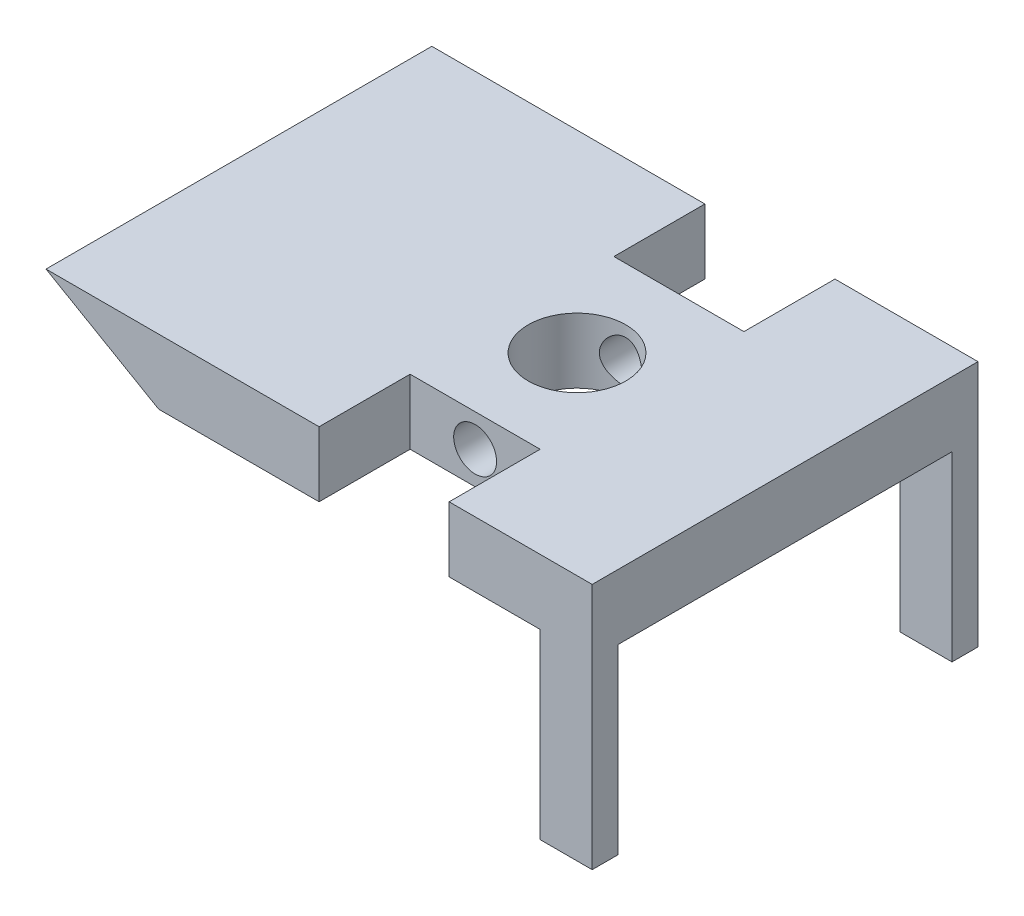
ISO-10303-21;
HEADER;
FILE_DESCRIPTION(('STEP AP214'),'2;1');
FILE_NAME('part.step','',(''),(''),'','','');
FILE_SCHEMA(('AUTOMOTIVE_DESIGN { 1 0 10303 214 1 1 1 1 }'));
ENDSEC;
DATA;
#1=APPLICATION_CONTEXT('core data for automotive mechanical design processes');
#2=APPLICATION_PROTOCOL_DEFINITION('international standard','automotive_design',2000,#1);
#3=PRODUCT_CONTEXT('',#1,'mechanical');
#4=PRODUCT('Part','Part','',(#3));
#5=PRODUCT_RELATED_PRODUCT_CATEGORY('part','',(#4));
#6=PRODUCT_DEFINITION_FORMATION('','',#4);
#7=PRODUCT_DEFINITION_CONTEXT('part definition',#1,'design');
#8=PRODUCT_DEFINITION('design','',#6,#7);
#9=PRODUCT_DEFINITION_SHAPE('','',#8);
#10=(LENGTH_UNIT() NAMED_UNIT(*) SI_UNIT(.MILLI.,.METRE.));
#11=(NAMED_UNIT(*) PLANE_ANGLE_UNIT() SI_UNIT($,.RADIAN.));
#12=(NAMED_UNIT(*) SI_UNIT($,.STERADIAN.) SOLID_ANGLE_UNIT());
#13=UNCERTAINTY_MEASURE_WITH_UNIT(LENGTH_MEASURE(1.E-05),#10,'distance_accuracy_value','');
#14=(GEOMETRIC_REPRESENTATION_CONTEXT(3) GLOBAL_UNCERTAINTY_ASSIGNED_CONTEXT((#13)) GLOBAL_UNIT_ASSIGNED_CONTEXT((#10,
#11,#12)) REPRESENTATION_CONTEXT('',''));
#15=CARTESIAN_POINT('',(0.,0.,0.));
#16=DIRECTION('',(0.,0.,1.));
#17=DIRECTION('',(1.,0.,0.));
#18=AXIS2_PLACEMENT_3D('',#15,#16,#17);
#19=CARTESIAN_POINT('',(17.,-16.5,-29.395219778561));
#20=DIRECTION('',(-1.,0.,0.));
#21=DIRECTION('',(0.,-1.,0.));
#22=AXIS2_PLACEMENT_3D('',#19,#20,#21);
#23=PLANE('',#22);
#24=DIRECTION('',(0.,1.,0.));
#25=VECTOR('',#24,1.);
#26=CARTESIAN_POINT('',(17.,-16.5,12.835));
#27=LINE('',#26,#25);
#28=CARTESIAN_POINT('',(17.,-16.5,12.835));
#29=VERTEX_POINT('',#28);
#30=CARTESIAN_POINT('',(17.,-2.50000000000001,12.835));
#31=VERTEX_POINT('',#30);
#32=EDGE_CURVE('E262',#29,#31,#27,.T.);
#33=ORIENTED_EDGE('',*,*,#32,.F.);
#34=DIRECTION('',(0.,0.,1.));
#35=VECTOR('',#34,1.);
#36=CARTESIAN_POINT('',(17.,-16.5,-29.395219778561));
#37=LINE('',#36,#35);
#38=CARTESIAN_POINT('',(17.,-16.5,14.835));
#39=VERTEX_POINT('',#38);
#40=EDGE_CURVE('E189',#29,#39,#37,.T.);
#41=ORIENTED_EDGE('',*,*,#40,.T.);
#42=DIRECTION('',(0.,-1.,0.));
#43=VECTOR('',#42,1.);
#44=CARTESIAN_POINT('',(17.,-16.5,14.835));
#45=LINE('',#44,#43);
#46=CARTESIAN_POINT('',(17.,-2.50000000000001,14.835));
#47=VERTEX_POINT('',#46);
#48=EDGE_CURVE('E264',#47,#39,#45,.T.);
#49=ORIENTED_EDGE('',*,*,#48,.F.);
#50=DIRECTION('',(0.,0.,1.));
#51=VECTOR('',#50,1.);
#52=CARTESIAN_POINT('',(17.,-2.50000000000001,-29.395219778561));
#53=LINE('',#52,#51);
#54=EDGE_CURVE('E69',#31,#47,#53,.T.);
#55=ORIENTED_EDGE('',*,*,#54,.F.);
#56=EDGE_LOOP('',(#33,#41,#49,#55));
#57=FACE_BOUND('',#56,.T.);
#58=ADVANCED_FACE('F45',(#57),#23,.T.);
#59=CARTESIAN_POINT('',(21.,-16.5,-29.395219778561));
#60=DIRECTION('',(0.,-1.,0.));
#61=DIRECTION('',(1.,0.,0.));
#62=AXIS2_PLACEMENT_3D('',#59,#60,#61);
#63=PLANE('',#62);
#64=DIRECTION('',(-1.,0.,0.));
#65=VECTOR('',#64,1.);
#66=CARTESIAN_POINT('',(21.,-16.5,12.835));
#67=LINE('',#66,#65);
#68=CARTESIAN_POINT('',(21.,-16.5,12.835));
#69=VERTEX_POINT('',#68);
#70=EDGE_CURVE('E11',#69,#29,#67,.T.);
#71=ORIENTED_EDGE('',*,*,#70,.F.);
#72=DIRECTION('',(0.,0.,1.));
#73=VECTOR('',#72,1.);
#74=CARTESIAN_POINT('',(21.,-16.5,-29.395219778561));
#75=LINE('',#74,#73);
#76=CARTESIAN_POINT('',(21.,-16.5,14.835));
#77=VERTEX_POINT('',#76);
#78=EDGE_CURVE('E187',#69,#77,#75,.T.);
#79=ORIENTED_EDGE('',*,*,#78,.T.);
#80=DIRECTION('',(1.,0.,0.));
#81=VECTOR('',#80,1.);
#82=CARTESIAN_POINT('',(21.,-16.5,14.835));
#83=LINE('',#82,#81);
#84=EDGE_CURVE('E269',#39,#77,#83,.T.);
#85=ORIENTED_EDGE('',*,*,#84,.F.);
#86=ORIENTED_EDGE('',*,*,#40,.F.);
#87=EDGE_LOOP('',(#71,#79,#85,#86));
#88=FACE_BOUND('',#87,.T.);
#89=ADVANCED_FACE('F185',(#88),#63,.T.);
#90=CARTESIAN_POINT('',(5.,0.,-14.836));
#91=DIRECTION('',(0.,0.,1.));
#92=DIRECTION('',(1.,0.,0.));
#93=AXIS2_PLACEMENT_3D('',#90,#91,#92);
#94=CYLINDRICAL_SURFACE('',#93,1.65);
#95=CARTESIAN_POINT('',(6.65,0.,-3.36749164809655));
#96=CARTESIAN_POINT('',(6.64999591948725,-0.0874743691332364,-3.36749607292385));
#97=CARTESIAN_POINT('',(6.64299960015496,-0.175092773934502,-3.37094939684784));
#98=CARTESIAN_POINT('',(6.61531716545798,-0.347757116865659,-3.38429832583538));
#99=CARTESIAN_POINT('',(6.59459592274656,-0.43279586708638,-3.39421046041475));
#100=CARTESIAN_POINT('',(6.54044870220548,-0.597493099250666,-3.41912171212209));
#101=CARTESIAN_POINT('',(6.50707857419381,-0.67717344538628,-3.43409843617774));
#102=CARTESIAN_POINT('',(6.42874832845569,-0.829783884986507,-3.46741736925901));
#103=CARTESIAN_POINT('',(6.38379002894348,-0.902715034980056,-3.48575905018413));
#104=CARTESIAN_POINT('',(6.28021734567749,-1.04487154765315,-3.52516638479344));
#105=CARTESIAN_POINT('',(6.22091990046756,-1.11357209474114,-3.54633091062051));
#106=CARTESIAN_POINT('',(6.09178303274802,-1.24044684009399,-3.5881911575404));
#107=CARTESIAN_POINT('',(6.02193928529622,-1.29861669819959,-3.60888668227713));
#108=CARTESIAN_POINT('',(5.86946484491625,-1.40556708343849,-3.64870271327509));
#109=CARTESIAN_POINT('',(5.78637319615618,-1.45374252984986,-3.66769507829858));
#110=CARTESIAN_POINT('',(5.61227632392994,-1.53520034882064,-3.700736202455));
#111=CARTESIAN_POINT('',(5.52127502438019,-1.5684900562803,-3.71478739560396));
#112=CARTESIAN_POINT('',(5.3394662745173,-1.61728382118504,-3.73565913311448));
#113=CARTESIAN_POINT('',(5.24894589824284,-1.63369687425848,-3.74284752867496));
#114=CARTESIAN_POINT('',(5.06617018053506,-1.65122350001048,-3.75052967187645));
#115=CARTESIAN_POINT('',(4.97391564874558,-1.65234404312534,-3.75102646959465));
#116=CARTESIAN_POINT('',(4.79695735459994,-1.63969762210196,-3.74547519866295));
#117=CARTESIAN_POINT('',(4.71216534970809,-1.6269337501266,-3.739868091581));
#118=CARTESIAN_POINT('',(4.5460705321449,-1.58862001141631,-3.72336083389609));
#119=CARTESIAN_POINT('',(4.46476797823857,-1.56306919822083,-3.71246029148675));
#120=CARTESIAN_POINT('',(4.30645273442336,-1.49962622377595,-3.68619520386884));
#121=CARTESIAN_POINT('',(4.22952453920683,-1.46155151512836,-3.67076501619212));
#122=CARTESIAN_POINT('',(4.08294686925941,-1.37433410623966,-3.63691910801703));
#123=CARTESIAN_POINT('',(4.01330005270581,-1.32518738450648,-3.6185023034251));
#124=CARTESIAN_POINT('',(3.87753504589473,-1.21281701199709,-3.57882020061428));
#125=CARTESIAN_POINT('',(3.81210572269681,-1.14879890575554,-3.5574447595915));
#126=CARTESIAN_POINT('',(3.69259260075723,-1.01070787762528,-3.51528240579217));
#127=CARTESIAN_POINT('',(3.63851423294623,-0.936630170451252,-3.49449577883282));
#128=CARTESIAN_POINT('',(3.54117220405855,-0.776800460066391,-3.45502479534648));
#129=CARTESIAN_POINT('',(3.49843008891747,-0.690699088400833,-3.43645839327868));
#130=CARTESIAN_POINT('',(3.42834028609234,-0.511490455495721,-3.40497856582965));
#131=CARTESIAN_POINT('',(3.40098013157646,-0.418388937355618,-3.39206056440346));
#132=CARTESIAN_POINT('',(3.36429227707904,-0.234744535363252,-3.37451456223478));
#133=CARTESIAN_POINT('',(3.35383875555708,-0.144476988157719,-3.36937064835984));
#134=CARTESIAN_POINT('',(3.34792333452705,0.0366498278836484,-3.36647574871939));
#135=CARTESIAN_POINT('',(3.35245516573098,0.127508833402355,-3.36872167133213));
#136=CARTESIAN_POINT('',(3.37535174013094,0.300038323378446,-3.37981562096985));
#137=CARTESIAN_POINT('',(3.39265374352297,0.381886932345077,-3.3881559621082));
#138=CARTESIAN_POINT('',(3.43914744636585,0.541431160999636,-3.40982287754369));
#139=CARTESIAN_POINT('',(3.46834214737761,0.619125726657332,-3.42315071054923));
#140=CARTESIAN_POINT('',(3.53921629690324,0.772027463841052,-3.45400682275722));
#141=CARTESIAN_POINT('',(3.58139272921155,0.846970827739328,-3.47169539316014));
#142=CARTESIAN_POINT('',(3.6765572613445,0.98910154331508,-3.50907546279441));
#143=CARTESIAN_POINT('',(3.72955038819797,1.05628526590527,-3.5287678911715));
#144=CARTESIAN_POINT('',(3.85062358980462,1.18748477509611,-3.57013856276202));
#145=CARTESIAN_POINT('',(3.9196470398001,1.25062896923803,-3.59183160476859));
#146=CARTESIAN_POINT('',(4.06778238636593,1.36462621623268,-3.63309467060809));
#147=CARTESIAN_POINT('',(4.14689558402023,1.41547768147165,-3.65266442003673));
#148=CARTESIAN_POINT('',(4.31400673932617,1.50362813045694,-3.68771558350776));
#149=CARTESIAN_POINT('',(4.40206664806587,1.54082304607772,-3.70316536765515));
#150=CARTESIAN_POINT('',(4.58405684732281,1.59956776607058,-3.72798894821772));
#151=CARTESIAN_POINT('',(4.6779831509097,1.62112807306508,-3.73736682301229));
#152=CARTESIAN_POINT('',(4.8612978165453,1.64656089333974,-3.74847245839303));
#153=CARTESIAN_POINT('',(4.95048512527525,1.65165818539736,-3.75072963755332));
#154=CARTESIAN_POINT('',(5.12843486064658,1.64739798838615,-3.74885512685435));
#155=CARTESIAN_POINT('',(5.21719737386056,1.63804358240265,-3.74472479968784));
#156=CARTESIAN_POINT('',(5.38782932587363,1.60602123171463,-3.7308324127445));
#157=CARTESIAN_POINT('',(5.46983114363675,1.58394115377817,-3.72131934376771));
#158=CARTESIAN_POINT('',(5.62890956243098,1.5277736246503,-3.69776205916142));
#159=CARTESIAN_POINT('',(5.70598528433432,1.493684037231,-3.68371703743449));
#160=CARTESIAN_POINT('',(5.8569304617613,1.41274147649753,-3.65162935021383));
#161=CARTESIAN_POINT('',(5.93049119711801,1.36537526372791,-3.63343300227536));
#162=CARTESIAN_POINT('',(6.06894266820481,1.25993695077241,-3.59513976322225));
#163=CARTESIAN_POINT('',(6.13382977719905,1.20186039623367,-3.57504208305736));
#164=CARTESIAN_POINT('',(6.25831260974055,1.07139703994961,-3.53324031823005));
#165=CARTESIAN_POINT('',(6.31711532685678,0.998252385431581,-3.51153178279635));
#166=CARTESIAN_POINT('',(6.42177534917193,0.842529476107377,-3.47047923678989));
#167=CARTESIAN_POINT('',(6.46762474174623,0.759945498298511,-3.45113667556083));
#168=CARTESIAN_POINT('',(6.5449162136947,0.587124299309076,-3.41723991894323));
#169=CARTESIAN_POINT('',(6.57632700235197,0.496870953906538,-3.40269614232787));
#170=CARTESIAN_POINT('',(6.62309555077018,0.31164351772582,-3.38064338773551));
#171=CARTESIAN_POINT('',(6.6385071714776,0.216686400884638,-3.3731108155642));
#172=CARTESIAN_POINT('',(6.64703108329939,0.100998496777649,-3.36894448238601));
#173=CARTESIAN_POINT('',(6.64814335262455,0.0808209970433322,-3.36840080987488));
#174=CARTESIAN_POINT('',(6.64962829144477,0.0404315640214873,-3.36767387701191));
#175=CARTESIAN_POINT('',(6.65000094320723,0.0202196299200109,-3.36749062530128));
#176=CARTESIAN_POINT('',(6.65,0.,-3.36749164809655));
#177=B_SPLINE_CURVE_WITH_KNOTS('',3,(#95,#96,#97,#98,#99,#100,#101,#102,#103,#104,#105,#106,
#107,#108,#109,#110,#111,#112,#113,#114,#115,#116,#117,#118,#119,#120,#121,#122,#123,#124,#125,
#126,#127,#128,#129,#130,#131,#132,#133,#134,#135,#136,#137,#138,#139,#140,#141,#142,#143,#144,
#145,#146,#147,#148,#149,#150,#151,#152,#153,#154,#155,#156,#157,#158,#159,#160,#161,#162,#163,
#164,#165,#166,#167,#168,#169,#170,#171,#172,#173,#174,#175,#176),.UNSPECIFIED.,.T.,.F.,(4,2,2,
2,2,2,2,2,2,2,2,2,2,2,2,2,2,2,2,2,2,2,2,2,2,2,2,2,2,2,2,2,2,2,2,2,2,2,2,2,4),(0.,
0.262337992001349,0.525350015511181,0.787214015160154,1.04903695265106,1.32739302247777,
1.60586355517072,1.89807751150631,2.19014732125288,2.46549872058573,2.74072460857159,
2.99731128459009,3.25391695538524,3.51444216606865,3.77506215572741,4.05582705551463,
4.336725984226,4.62890596840992,4.92084880275994,5.1924046605751,5.46384692437079,
5.71493513596501,5.96608675823259,6.22839495294345,6.49082533337074,6.77759301230099,
7.06439770769602,7.35334470453729,7.64209741960136,7.90880391080322,8.17545351143564,
8.43067328899049,8.68593848747794,8.95289970595718,9.21997220307098,9.50762420315227,
9.79545153931287,10.0838997352209,10.371373694431,10.4320114560409,10.4926506714452),.UNSPECIFIED.);
#178=CARTESIAN_POINT('',(6.65,0.,-3.36749164809655));
#179=VERTEX_POINT('',#178);
#180=EDGE_CURVE('E221',#179,#179,#177,.T.);
#181=ORIENTED_EDGE('',*,*,#180,.F.);
#182=EDGE_LOOP('',(#181));
#183=FACE_BOUND('',#182,.T.);
#184=CARTESIAN_POINT('',(5.,0.,-7.835));
#185=DIRECTION('',(0.,0.,1.));
#186=DIRECTION('',(1.,0.,0.));
#187=AXIS2_PLACEMENT_3D('',#184,#185,#186);
#188=CIRCLE('',#187,1.65);
#189=CARTESIAN_POINT('',(6.65,0.,-7.835));
#190=VERTEX_POINT('',#189);
#191=EDGE_CURVE('E398',#190,#190,#188,.T.);
#192=ORIENTED_EDGE('',*,*,#191,.F.);
#193=EDGE_LOOP('',(#192));
#194=FACE_BOUND('',#193,.T.);
#195=ADVANCED_FACE('F261',(#183,#194),#94,.F.);
#196=CARTESIAN_POINT('',(5.,-1.64999999999999,3.75));
#197=CARTESIAN_POINT('',(5.08794065243915,-1.6499960382256,3.74999677525689));
#198=CARTESIAN_POINT('',(5.17602118872723,-1.64292811014753,3.7468719189208));
#199=CARTESIAN_POINT('',(5.34965330491862,-1.61493414299231,3.734683166008));
#200=CARTESIAN_POINT('',(5.43519818666942,-1.59397431770862,3.72560479056562));
#201=CARTESIAN_POINT('',(5.60097235797528,-1.53913128450559,3.70247374212791));
#202=CARTESIAN_POINT('',(5.68121929706646,-1.50529382267499,3.68843868963418));
#203=CARTESIAN_POINT('',(5.83481096834596,-1.42585820871191,3.65674015300381));
#204=CARTESIAN_POINT('',(5.90815735131847,-1.38026287916685,3.63907753990429));
#205=CARTESIAN_POINT('',(6.05000163649843,-1.27598104842034,3.60078615738986));
#206=CARTESIAN_POINT('',(6.11807366426439,-1.21675391782858,3.58005322837619));
#207=CARTESIAN_POINT('',(6.2436925761984,-1.08803679555133,3.53837779505836));
#208=CARTESIAN_POINT('',(6.30123331014303,-1.01854084946944,3.51743517577732));
#209=CARTESIAN_POINT('',(6.40737198125606,-0.866527492523986,3.47638120662905));
#210=CARTESIAN_POINT('',(6.45528386928225,-0.78349719201842,3.45638307676996));
#211=CARTESIAN_POINT('',(6.53627172599083,-0.609555260312101,3.4211597332649));
#212=CARTESIAN_POINT('',(6.56935619199839,-0.518648178890952,3.40593178742375));
#213=CARTESIAN_POINT('',(6.61794121689661,-0.336431274272976,3.3831135312385));
#214=CARTESIAN_POINT('',(6.63426566626132,-0.245387501455792,3.37516767353209));
#215=CARTESIAN_POINT('',(6.65143054751147,-0.0615333461945505,3.3668053594707));
#216=CARTESIAN_POINT('',(6.65228100759649,0.0312758530848587,3.36638402671406));
#217=CARTESIAN_POINT('',(6.63908919688508,0.207355873544235,3.37282106403821));
#218=CARTESIAN_POINT('',(6.62634141864489,0.29075168979451,3.37904671722602));
#219=CARTESIAN_POINT('',(6.58850520692874,0.454071225614283,3.39699646382115));
#220=CARTESIAN_POINT('',(6.56341407162607,0.533994180841902,3.40872176101459));
#221=CARTESIAN_POINT('',(6.50110649630304,0.690226926082294,3.43662073577462));
#222=CARTESIAN_POINT('',(6.46363227970243,0.766416489003962,3.45288773136686));
#223=CARTESIAN_POINT('',(6.37780710670808,0.911743878376047,3.48802159021638));
#224=CARTESIAN_POINT('',(6.32945161231713,0.98087874515625,3.50688953691532));
#225=CARTESIAN_POINT('',(6.21783776896922,1.11706798335261,3.54728261097474));
#226=CARTESIAN_POINT('',(6.15359849475329,1.18329659100237,3.56888963165699));
#227=CARTESIAN_POINT('',(6.01473808953318,1.30433611063187,3.61082599340459));
#228=CARTESIAN_POINT('',(5.94011395212262,1.35914370472461,3.63115496199219));
#229=CARTESIAN_POINT('',(5.77984544173489,1.45719190039969,3.66896451776514));
#230=CARTESIAN_POINT('',(5.69394811565676,1.50005943159356,3.68634771561839));
#231=CARTESIAN_POINT('',(5.51519989197507,1.57043908051861,3.71554130843415));
#232=CARTESIAN_POINT('',(5.42235333017465,1.59796068385572,3.72735514522372));
#233=CARTESIAN_POINT('',(5.23921022750967,1.63505304083378,3.74341295596741));
#234=CARTESIAN_POINT('',(5.14917854061996,1.64572966452199,3.74812228788192));
#235=CARTESIAN_POINT('',(4.96849247665594,1.65217171911426,3.75095455785044));
#236=CARTESIAN_POINT('',(4.87783831540074,1.64794208106069,3.74907967398628));
#237=CARTESIAN_POINT('',(4.70390665287527,1.62544881834209,3.73925037459651));
#238=CARTESIAN_POINT('',(4.62050230959725,1.60799437581935,3.73164663418775));
#239=CARTESIAN_POINT('',(4.45791706209694,1.56071027218964,3.71151728629914));
#240=CARTESIAN_POINT('',(4.37873667607145,1.5308790966223,3.69899107649862));
#241=CARTESIAN_POINT('',(4.22404079862632,1.45873229578338,3.66971134498956));
#242=CARTESIAN_POINT('',(4.14871703627141,1.41605581574278,3.65283800179973));
#243=CARTESIAN_POINT('',(4.00602810222664,1.31982329381418,3.61662102234894));
#244=CARTESIAN_POINT('',(3.93866640117434,1.26626253496258,3.5972763164179));
#245=CARTESIAN_POINT('',(3.80819611837273,1.14484038573233,3.55628214760162));
#246=CARTESIAN_POINT('',(3.74584598439284,1.07618271743489,3.53457144282308));
#247=CARTESIAN_POINT('',(3.63330445356358,0.929097206857137,3.49260064747062));
#248=CARTESIAN_POINT('',(3.58311709508679,0.850666132592158,3.47234104026914));
#249=CARTESIAN_POINT('',(3.49540307748589,0.683921591275968,3.43526035744153));
#250=CARTESIAN_POINT('',(3.45817723591055,0.595429542818643,3.4185241503665));
#251=CARTESIAN_POINT('',(3.39950438017547,0.412456963898674,3.39145640297362));
#252=CARTESIAN_POINT('',(3.37804232181517,0.317982236816926,3.38111875766089));
#253=CARTESIAN_POINT('',(3.35307874998712,0.134229339541124,3.36902436868046));
#254=CARTESIAN_POINT('',(3.34822601990919,0.045176805306792,3.36662264808986));
#255=CARTESIAN_POINT('',(3.35292803694661,-0.132443324028014,3.36892598901368));
#256=CARTESIAN_POINT('',(3.36247987258739,-0.221011013494946,3.37362961438418));
#257=CARTESIAN_POINT('',(3.39454415171674,-0.389834130472378,3.38899632048544));
#258=CARTESIAN_POINT('',(3.41627535473376,-0.470274087988884,3.39929913530275));
#259=CARTESIAN_POINT('',(3.4712672768033,-0.626361280798586,3.42438089295876));
#260=CARTESIAN_POINT('',(3.50453131275969,-0.702007129869665,3.43916112337133));
#261=CARTESIAN_POINT('',(3.58406507679427,-0.851619735953296,3.47269356886383));
#262=CARTESIAN_POINT('',(3.63102681157857,-0.925174495154689,3.49163847278619));
#263=CARTESIAN_POINT('',(3.7357127896172,-1.06377992281055,3.53089238653571));
#264=CARTESIAN_POINT('',(3.79344141213049,-1.12882711256768,3.55120194925799));
#265=CARTESIAN_POINT('',(3.92382903951875,-1.25428003578286,3.59296880703805));
#266=CARTESIAN_POINT('',(3.99734015606778,-1.31382091586416,3.61437686935989));
#267=CARTESIAN_POINT('',(4.15406955877593,-1.41980560454865,3.65423468677977));
#268=CARTESIAN_POINT('',(4.23729223810856,-1.46624345307614,3.67268309400139));
#269=CARTESIAN_POINT('',(4.41023740744423,-1.54387701756613,3.70436408768263));
#270=CARTESIAN_POINT('',(4.49986734754799,-1.57525320509646,3.71765804406783));
#271=CARTESIAN_POINT('',(4.68371482188615,-1.62216171678276,3.73777368374933));
#272=CARTESIAN_POINT('',(4.77791736039553,-1.63774259010251,3.74461519501638));
#273=CARTESIAN_POINT('',(4.89387606102141,-1.64672172070878,3.7485588513459));
#274=CARTESIAN_POINT('',(4.91507632147087,-1.64794995964318,3.74909837906909));
#275=CARTESIAN_POINT('',(4.95751499929637,-1.6495895819625,3.74981934473969));
#276=CARTESIAN_POINT('',(4.97875341705226,-1.65000095717015,3.75000077910238));
#277=CARTESIAN_POINT('',(5.,-1.64999999999999,3.75));
#278=B_SPLINE_CURVE_WITH_KNOTS('',3,(#196,#197,#198,#199,#200,#201,#202,#203,#204,#205,#206,
#207,#208,#209,#210,#211,#212,#213,#214,#215,#216,#217,#218,#219,#220,#221,#222,#223,#224,#225,
#226,#227,#228,#229,#230,#231,#232,#233,#234,#235,#236,#237,#238,#239,#240,#241,#242,#243,#244,
#245,#246,#247,#248,#249,#250,#251,#252,#253,#254,#255,#256,#257,#258,#259,#260,#261,#262,#263,
#264,#265,#266,#267,#268,#269,#270,#271,#272,#273,#274,#275,#276,#277),.UNSPECIFIED.,.T.,.F.,(4,
2,2,2,2,2,2,2,2,2,2,2,2,2,2,2,2,2,2,2,2,2,2,2,2,2,2,2,2,2,2,2,2,2,2,2,2,2,2,2,4),(0.,
0.263734510147989,0.52811280905045,0.791560575603074,1.05494515780487,1.33150079465859,
1.60821742685178,1.90051649596436,2.19264783893791,2.46960925800041,2.74639118079142,
2.99899429642278,3.25165272874969,3.50994222706956,3.76833964437948,4.05135561937526,
4.33445369828947,4.62559874662744,4.91656363268483,5.18748705235547,5.45832085804592,
5.71380105020368,5.96931251303603,6.23280504553124,6.49641201330445,6.78088013255852,
7.06544257396593,7.35622693243306,7.64673341835486,7.91295937269031,8.17913152420861,
8.42991502344918,8.68077070926695,8.94756356427704,9.21446517058845,9.50405959505639,
9.79378553355286,10.0799474542432,10.3652271238324,10.4289451074685,10.4926637289549),.UNSPECIFIED.);
#279=CARTESIAN_POINT('',(5.,-1.64999999999999,3.75));
#280=VERTEX_POINT('',#279);
#281=EDGE_CURVE('E230',#280,#280,#278,.T.);
#282=ORIENTED_EDGE('',*,*,#281,.F.);
#283=EDGE_LOOP('',(#282));
#284=FACE_BOUND('',#283,.T.);
#285=CARTESIAN_POINT('',(5.,0.,7.835));
#286=DIRECTION('',(0.,0.,1.));
#287=DIRECTION('',(1.,0.,0.));
#288=AXIS2_PLACEMENT_3D('',#285,#286,#287);
#289=CIRCLE('',#288,1.65);
#290=CARTESIAN_POINT('',(6.65,0.,7.835));
#291=VERTEX_POINT('',#290);
#292=EDGE_CURVE('E357',#291,#291,#289,.T.);
#293=ORIENTED_EDGE('',*,*,#292,.T.);
#294=EDGE_LOOP('',(#293));
#295=FACE_BOUND('',#294,.T.);
#296=ADVANCED_FACE('F420',(#284,#295),#94,.F.);
#297=CARTESIAN_POINT('',(-21.,2.50000000000001,14.835));
#298=DIRECTION('',(0.,-1.,0.));
#299=DIRECTION('',(1.,0.,0.));
#300=AXIS2_PLACEMENT_3D('',#297,#298,#299);
#301=PLANE('',#300);
#302=CARTESIAN_POINT('',(5.,2.5,0.));
#303=DIRECTION('',(0.,1.,0.));
#304=DIRECTION('',(0.,0.,1.));
#305=AXIS2_PLACEMENT_3D('',#302,#303,#304);
#306=CIRCLE('',#305,3.75);
#307=CARTESIAN_POINT('',(5.,2.5,3.75));
#308=VERTEX_POINT('',#307);
#309=EDGE_CURVE('E213',#308,#308,#306,.T.);
#310=ORIENTED_EDGE('',*,*,#309,.F.);
#311=EDGE_LOOP('',(#310));
#312=FACE_BOUND('',#311,.T.);
#313=DIRECTION('',(0.,0.,-1.));
#314=VECTOR('',#313,1.);
#315=CARTESIAN_POINT('',(0.,2.50000000000001,-7.835));
#316=LINE('',#315,#314);
#317=CARTESIAN_POINT('',(0.,2.50000000000001,-7.835));
#318=VERTEX_POINT('',#317);
#319=CARTESIAN_POINT('',(0.,2.50000000000001,-14.835));
#320=VERTEX_POINT('',#319);
#321=EDGE_CURVE('E376',#318,#320,#316,.T.);
#322=ORIENTED_EDGE('',*,*,#321,.T.);
#323=DIRECTION('',(-1.,0.,0.));
#324=VECTOR('',#323,1.);
#325=CARTESIAN_POINT('',(-21.,2.50000000000001,-14.835));
#326=LINE('',#325,#324);
#327=CARTESIAN_POINT('',(-21.,2.50000000000001,-14.835));
#328=VERTEX_POINT('',#327);
#329=EDGE_CURVE('E318',#320,#328,#326,.T.);
#330=ORIENTED_EDGE('',*,*,#329,.T.);
#331=DIRECTION('',(0.,0.,-1.));
#332=VECTOR('',#331,1.);
#333=CARTESIAN_POINT('',(-21.,2.50000000000001,14.835));
#334=LINE('',#333,#332);
#335=CARTESIAN_POINT('',(-21.,2.50000000000001,14.835));
#336=VERTEX_POINT('',#335);
#337=EDGE_CURVE('E296',#336,#328,#334,.T.);
#338=ORIENTED_EDGE('',*,*,#337,.F.);
#339=DIRECTION('',(-1.,0.,0.));
#340=VECTOR('',#339,1.);
#341=CARTESIAN_POINT('',(-21.,2.50000000000001,14.835));
#342=LINE('',#341,#340);
#343=CARTESIAN_POINT('',(0.,2.50000000000001,14.835));
#344=VERTEX_POINT('',#343);
#345=EDGE_CURVE('E333',#344,#336,#342,.T.);
#346=ORIENTED_EDGE('',*,*,#345,.F.);
#347=DIRECTION('',(0.,0.,1.));
#348=VECTOR('',#347,1.);
#349=CARTESIAN_POINT('',(0.,2.50000000000001,7.835));
#350=LINE('',#349,#348);
#351=CARTESIAN_POINT('',(0.,2.50000000000001,7.835));
#352=VERTEX_POINT('',#351);
#353=EDGE_CURVE('E321',#352,#344,#350,.T.);
#354=ORIENTED_EDGE('',*,*,#353,.F.);
#355=DIRECTION('',(-1.,0.,0.));
#356=VECTOR('',#355,1.);
#357=CARTESIAN_POINT('',(9.99999999999999,2.50000000000001,7.835));
#358=LINE('',#357,#356);
#359=CARTESIAN_POINT('',(9.99999999999999,2.50000000000001,7.835));
#360=VERTEX_POINT('',#359);
#361=EDGE_CURVE('E341',#360,#352,#358,.T.);
#362=ORIENTED_EDGE('',*,*,#361,.F.);
#363=DIRECTION('',(0.,0.,1.));
#364=VECTOR('',#363,1.);
#365=CARTESIAN_POINT('',(9.99999999999999,2.50000000000001,7.835));
#366=LINE('',#365,#364);
#367=CARTESIAN_POINT('',(9.99999999999999,2.50000000000001,14.835));
#368=VERTEX_POINT('',#367);
#369=EDGE_CURVE('E344',#360,#368,#366,.T.);
#370=ORIENTED_EDGE('',*,*,#369,.T.);
#371=CARTESIAN_POINT('',(21.,2.49999999999999,14.835));
#372=VERTEX_POINT('',#371);
#373=EDGE_CURVE('E329',#372,#368,#342,.T.);
#374=ORIENTED_EDGE('',*,*,#373,.F.);
#375=DIRECTION('',(0.,0.,-1.));
#376=VECTOR('',#375,1.);
#377=CARTESIAN_POINT('',(21.,2.49999999999999,14.835));
#378=LINE('',#377,#376);
#379=CARTESIAN_POINT('',(21.,2.49999999999999,-14.835));
#380=VERTEX_POINT('',#379);
#381=EDGE_CURVE('E293',#372,#380,#378,.T.);
#382=ORIENTED_EDGE('',*,*,#381,.T.);
#383=CARTESIAN_POINT('',(9.99999999999999,2.49999999999999,-14.835));
#384=VERTEX_POINT('',#383);
#385=EDGE_CURVE('E314',#380,#384,#326,.T.);
#386=ORIENTED_EDGE('',*,*,#385,.T.);
#387=DIRECTION('',(0.,0.,-1.));
#388=VECTOR('',#387,1.);
#389=CARTESIAN_POINT('',(9.99999999999999,2.50000000000001,-7.835));
#390=LINE('',#389,#388);
#391=CARTESIAN_POINT('',(9.99999999999999,2.50000000000001,-7.835));
#392=VERTEX_POINT('',#391);
#393=EDGE_CURVE('E380',#392,#384,#390,.T.);
#394=ORIENTED_EDGE('',*,*,#393,.F.);
#395=DIRECTION('',(-1.,0.,0.));
#396=VECTOR('',#395,1.);
#397=CARTESIAN_POINT('',(9.99999999999999,2.50000000000001,-7.835));
#398=LINE('',#397,#396);
#399=EDGE_CURVE('E405',#392,#318,#398,.T.);
#400=ORIENTED_EDGE('',*,*,#399,.T.);
#401=EDGE_LOOP('',(#322,#330,#338,#346,#354,#362,#370,#374,#382,#386,#394,#400));
#402=FACE_BOUND('',#401,.T.);
#403=ADVANCED_FACE('F423',(#312,#402),#301,.F.);
#404=CARTESIAN_POINT('',(-12.3397459621556,-2.50000000000001,14.835));
#405=DIRECTION('',(0.,1.,0.));
#406=DIRECTION('',(0.,0.,1.));
#407=AXIS2_PLACEMENT_3D('',#404,#405,#406);
#408=PLANE('',#407);
#409=DIRECTION('',(1.,0.,0.));
#410=VECTOR('',#409,1.);
#411=CARTESIAN_POINT('',(11.,-2.5,12.835));
#412=LINE('',#411,#410);
#413=CARTESIAN_POINT('',(21.,-2.50000000000002,12.835));
#414=VERTEX_POINT('',#413);
#415=EDGE_CURVE('E175',#31,#414,#412,.T.);
#416=ORIENTED_EDGE('',*,*,#415,.F.);
#417=ORIENTED_EDGE('',*,*,#54,.T.);
#418=DIRECTION('',(1.,0.,0.));
#419=VECTOR('',#418,1.);
#420=CARTESIAN_POINT('',(-12.3397459621556,-2.50000000000001,14.835));
#421=LINE('',#420,#419);
#422=CARTESIAN_POINT('',(10.,-2.50000000000001,14.835));
#423=VERTEX_POINT('',#422);
#424=EDGE_CURVE('E325',#423,#47,#421,.T.);
#425=ORIENTED_EDGE('',*,*,#424,.F.);
#426=DIRECTION('',(0.,0.,1.));
#427=VECTOR('',#426,1.);
#428=CARTESIAN_POINT('',(9.99999999999999,-2.49999999999999,7.835));
#429=LINE('',#428,#427);
#430=CARTESIAN_POINT('',(9.99999999999999,-2.49999999999999,7.835));
#431=VERTEX_POINT('',#430);
#432=EDGE_CURVE('E340',#431,#423,#429,.T.);
#433=ORIENTED_EDGE('',*,*,#432,.F.);
#434=DIRECTION('',(1.,0.,0.));
#435=VECTOR('',#434,1.);
#436=CARTESIAN_POINT('',(9.99999999999999,-2.49999999999999,7.835));
#437=LINE('',#436,#435);
#438=CARTESIAN_POINT('',(0.,-2.49999999999999,7.835));
#439=VERTEX_POINT('',#438);
#440=EDGE_CURVE('E365',#439,#431,#437,.T.);
#441=ORIENTED_EDGE('',*,*,#440,.F.);
#442=DIRECTION('',(0.,0.,1.));
#443=VECTOR('',#442,1.);
#444=CARTESIAN_POINT('',(0.,-2.49999999999999,7.835));
#445=LINE('',#444,#443);
#446=CARTESIAN_POINT('',(0.,-2.49999999999999,14.835));
#447=VERTEX_POINT('',#446);
#448=EDGE_CURVE('E336',#439,#447,#445,.T.);
#449=ORIENTED_EDGE('',*,*,#448,.T.);
#450=CARTESIAN_POINT('',(-12.3397459621556,-2.50000000000001,14.835));
#451=VERTEX_POINT('',#450);
#452=EDGE_CURVE('E306',#451,#447,#421,.T.);
#453=ORIENTED_EDGE('',*,*,#452,.F.);
#454=DIRECTION('',(0.,0.,-1.));
#455=VECTOR('',#454,1.);
#456=CARTESIAN_POINT('',(-12.3397459621556,-2.50000000000001,14.835));
#457=LINE('',#456,#455);
#458=CARTESIAN_POINT('',(-12.3397459621556,-2.50000000000001,-14.835));
#459=VERTEX_POINT('',#458);
#460=EDGE_CURVE('E302',#451,#459,#457,.T.);
#461=ORIENTED_EDGE('',*,*,#460,.T.);
#462=DIRECTION('',(1.,0.,0.));
#463=VECTOR('',#462,1.);
#464=CARTESIAN_POINT('',(-12.3397459621556,-2.50000000000001,-14.835));
#465=LINE('',#464,#463);
#466=CARTESIAN_POINT('',(0.,-2.49999999999999,-14.835));
#467=VERTEX_POINT('',#466);
#468=EDGE_CURVE('E307',#459,#467,#465,.T.);
#469=ORIENTED_EDGE('',*,*,#468,.T.);
#470=DIRECTION('',(0.,0.,-1.));
#471=VECTOR('',#470,1.);
#472=CARTESIAN_POINT('',(0.,-2.49999999999999,-7.835));
#473=LINE('',#472,#471);
#474=CARTESIAN_POINT('',(0.,-2.49999999999999,-7.835));
#475=VERTEX_POINT('',#474);
#476=EDGE_CURVE('E375',#475,#467,#473,.T.);
#477=ORIENTED_EDGE('',*,*,#476,.F.);
#478=DIRECTION('',(1.,0.,0.));
#479=VECTOR('',#478,1.);
#480=CARTESIAN_POINT('',(9.99999999999999,-2.49999999999999,-7.835));
#481=LINE('',#480,#479);
#482=CARTESIAN_POINT('',(9.99999999999999,-2.49999999999999,-7.835));
#483=VERTEX_POINT('',#482);
#484=EDGE_CURVE('E381',#475,#483,#481,.T.);
#485=ORIENTED_EDGE('',*,*,#484,.T.);
#486=DIRECTION('',(0.,0.,-1.));
#487=VECTOR('',#486,1.);
#488=CARTESIAN_POINT('',(9.99999999999999,-2.49999999999999,-7.835));
#489=LINE('',#488,#487);
#490=CARTESIAN_POINT('',(9.99999999999999,-2.49999999999999,-14.835));
#491=VERTEX_POINT('',#490);
#492=EDGE_CURVE('E384',#483,#491,#489,.T.);
#493=ORIENTED_EDGE('',*,*,#492,.T.);
#494=CARTESIAN_POINT('',(17.,-2.50000000000001,-14.835));
#495=VERTEX_POINT('',#494);
#496=EDGE_CURVE('E286',#491,#495,#465,.T.);
#497=ORIENTED_EDGE('',*,*,#496,.T.);
#498=CARTESIAN_POINT('',(17.,-2.50000000000001,-12.835));
#499=VERTEX_POINT('',#498);
#500=EDGE_CURVE('E209',#495,#499,#53,.T.);
#501=ORIENTED_EDGE('',*,*,#500,.T.);
#502=DIRECTION('',(1.,0.,0.));
#503=VECTOR('',#502,1.);
#504=CARTESIAN_POINT('',(11.,-2.5,-12.835));
#505=LINE('',#504,#503);
#506=CARTESIAN_POINT('',(21.,-2.50000000000002,-12.835));
#507=VERTEX_POINT('',#506);
#508=EDGE_CURVE('E653',#499,#507,#505,.T.);
#509=ORIENTED_EDGE('',*,*,#508,.T.);
#510=DIRECTION('',(0.,0.,1.));
#511=VECTOR('',#510,1.);
#512=CARTESIAN_POINT('',(21.,-2.50000000000002,12.835));
#513=LINE('',#512,#511);
#514=EDGE_CURVE('E654',#507,#414,#513,.T.);
#515=ORIENTED_EDGE('',*,*,#514,.T.);
#516=EDGE_LOOP('',(#416,#417,#425,#433,#441,#449,#453,#461,#469,#477,#485,#493,#497,#501,#509,#515));
#517=FACE_BOUND('',#516,.T.);
#518=CARTESIAN_POINT('',(5.,-2.50000000000001,0.));
#519=DIRECTION('',(0.,1.,0.));
#520=DIRECTION('',(0.,0.,1.));
#521=AXIS2_PLACEMENT_3D('',#518,#519,#520);
#522=CIRCLE('',#521,3.75);
#523=CARTESIAN_POINT('',(5.,-2.50000000000001,3.75));
#524=VERTEX_POINT('',#523);
#525=EDGE_CURVE('E217',#524,#524,#522,.F.);
#526=ORIENTED_EDGE('',*,*,#525,.F.);
#527=EDGE_LOOP('',(#526));
#528=FACE_BOUND('',#527,.T.);
#529=ADVANCED_FACE('F438',(#517,#528),#408,.F.);
#530=CARTESIAN_POINT('',(0.,0.,-14.835));
#531=DIRECTION('',(0.,0.,-1.));
#532=DIRECTION('',(-1.,0.,0.));
#533=AXIS2_PLACEMENT_3D('',#530,#531,#532);
#534=PLANE('',#533);
#535=ORIENTED_EDGE('',*,*,#329,.F.);
#536=DIRECTION('',(0.,-1.,0.));
#537=VECTOR('',#536,1.);
#538=CARTESIAN_POINT('',(0.,-2.49999999999999,-14.835));
#539=LINE('',#538,#537);
#540=EDGE_CURVE('E394',#320,#467,#539,.T.);
#541=ORIENTED_EDGE('',*,*,#540,.T.);
#542=ORIENTED_EDGE('',*,*,#468,.F.);
#543=DIRECTION('',(0.866025403784438,-0.500000000000001,0.));
#544=VECTOR('',#543,1.);
#545=CARTESIAN_POINT('',(-21.,2.50000000000001,-14.835));
#546=LINE('',#545,#544);
#547=EDGE_CURVE('E311',#328,#459,#546,.T.);
#548=ORIENTED_EDGE('',*,*,#547,.F.);
#549=EDGE_LOOP('',(#535,#541,#542,#548));
#550=FACE_BOUND('',#549,.T.);
#551=ADVANCED_FACE('F461',(#550),#534,.T.);
#552=ORIENTED_EDGE('',*,*,#496,.F.);
#553=DIRECTION('',(0.,1.,0.));
#554=VECTOR('',#553,1.);
#555=CARTESIAN_POINT('',(9.99999999999999,-2.49999999999999,-14.835));
#556=LINE('',#555,#554);
#557=EDGE_CURVE('E390',#491,#384,#556,.T.);
#558=ORIENTED_EDGE('',*,*,#557,.T.);
#559=ORIENTED_EDGE('',*,*,#385,.F.);
#560=DIRECTION('',(0.,1.,0.));
#561=VECTOR('',#560,1.);
#562=CARTESIAN_POINT('',(21.,-2.50000000000001,-14.835));
#563=LINE('',#562,#561);
#564=CARTESIAN_POINT('',(21.,-16.5,-14.835));
#565=VERTEX_POINT('',#564);
#566=EDGE_CURVE('E288',#565,#380,#563,.T.);
#567=ORIENTED_EDGE('',*,*,#566,.F.);
#568=DIRECTION('',(1.,0.,0.));
#569=VECTOR('',#568,1.);
#570=CARTESIAN_POINT('',(21.,-16.5,-14.835));
#571=LINE('',#570,#569);
#572=CARTESIAN_POINT('',(17.,-16.5,-14.835));
#573=VERTEX_POINT('',#572);
#574=EDGE_CURVE('E196',#573,#565,#571,.T.);
#575=ORIENTED_EDGE('',*,*,#574,.F.);
#576=DIRECTION('',(0.,-1.,0.));
#577=VECTOR('',#576,1.);
#578=CARTESIAN_POINT('',(17.,-16.5,-14.835));
#579=LINE('',#578,#577);
#580=EDGE_CURVE('E275',#495,#573,#579,.T.);
#581=ORIENTED_EDGE('',*,*,#580,.F.);
#582=EDGE_LOOP('',(#552,#558,#559,#567,#575,#581));
#583=FACE_BOUND('',#582,.T.);
#584=ADVANCED_FACE('F284',(#583),#534,.T.);
#585=CARTESIAN_POINT('',(0.,0.,14.835));
#586=DIRECTION('',(0.,0.,-1.));
#587=DIRECTION('',(-1.,0.,0.));
#588=AXIS2_PLACEMENT_3D('',#585,#586,#587);
#589=PLANE('',#588);
#590=ORIENTED_EDGE('',*,*,#452,.T.);
#591=DIRECTION('',(0.,-1.,0.));
#592=VECTOR('',#591,1.);
#593=CARTESIAN_POINT('',(0.,-2.49999999999999,14.835));
#594=LINE('',#593,#592);
#595=EDGE_CURVE('E354',#344,#447,#594,.T.);
#596=ORIENTED_EDGE('',*,*,#595,.F.);
#597=ORIENTED_EDGE('',*,*,#345,.T.);
#598=DIRECTION('',(0.866025403784438,-0.500000000000001,0.));
#599=VECTOR('',#598,1.);
#600=CARTESIAN_POINT('',(-21.,2.50000000000001,14.835));
#601=LINE('',#600,#599);
#602=EDGE_CURVE('E326',#336,#451,#601,.T.);
#603=ORIENTED_EDGE('',*,*,#602,.T.);
#604=EDGE_LOOP('',(#590,#596,#597,#603));
#605=FACE_BOUND('',#604,.T.);
#606=ADVANCED_FACE('F452',(#605),#589,.F.);
#607=CARTESIAN_POINT('',(21.,-2.50000000000001,14.835));
#608=DIRECTION('',(-1.,0.,0.));
#609=DIRECTION('',(0.,-1.,0.));
#610=AXIS2_PLACEMENT_3D('',#607,#608,#609);
#611=PLANE('',#610);
#612=ORIENTED_EDGE('',*,*,#78,.F.);
#613=DIRECTION('',(0.,-1.,0.));
#614=VECTOR('',#613,1.);
#615=CARTESIAN_POINT('',(21.,-16.5,12.835));
#616=LINE('',#615,#614);
#617=EDGE_CURVE('E171',#414,#69,#616,.T.);
#618=ORIENTED_EDGE('',*,*,#617,.F.);
#619=ORIENTED_EDGE('',*,*,#514,.F.);
#620=DIRECTION('',(0.,1.,0.));
#621=VECTOR('',#620,1.);
#622=CARTESIAN_POINT('',(21.,-16.5,-12.835));
#623=LINE('',#622,#621);
#624=CARTESIAN_POINT('',(21.,-16.5,-12.835));
#625=VERTEX_POINT('',#624);
#626=EDGE_CURVE('E181',#625,#507,#623,.T.);
#627=ORIENTED_EDGE('',*,*,#626,.F.);
#628=EDGE_CURVE('E195',#565,#625,#75,.T.);
#629=ORIENTED_EDGE('',*,*,#628,.F.);
#630=ORIENTED_EDGE('',*,*,#566,.T.);
#631=ORIENTED_EDGE('',*,*,#381,.F.);
#632=DIRECTION('',(0.,1.,0.));
#633=VECTOR('',#632,1.);
#634=CARTESIAN_POINT('',(21.,-2.50000000000001,14.835));
#635=LINE('',#634,#633);
#636=EDGE_CURVE('E192',#77,#372,#635,.T.);
#637=ORIENTED_EDGE('',*,*,#636,.F.);
#638=EDGE_LOOP('',(#612,#618,#619,#627,#629,#630,#631,#637));
#639=FACE_BOUND('',#638,.T.);
#640=ADVANCED_FACE('F47',(#639),#611,.F.);
#641=CARTESIAN_POINT('',(-21.,2.50000000000001,14.835));
#642=DIRECTION('',(0.500000000000001,0.866025403784438,0.));
#643=DIRECTION('',(-0.866025403784438,0.500000000000001,0.));
#644=AXIS2_PLACEMENT_3D('',#641,#642,#643);
#645=PLANE('',#644);
#646=ORIENTED_EDGE('',*,*,#547,.T.);
#647=ORIENTED_EDGE('',*,*,#460,.F.);
#648=ORIENTED_EDGE('',*,*,#602,.F.);
#649=ORIENTED_EDGE('',*,*,#337,.T.);
#650=EDGE_LOOP('',(#646,#647,#648,#649));
#651=FACE_BOUND('',#650,.T.);
#652=ADVANCED_FACE('F486',(#651),#645,.F.);
#653=ORIENTED_EDGE('',*,*,#373,.T.);
#654=DIRECTION('',(0.,1.,0.));
#655=VECTOR('',#654,1.);
#656=CARTESIAN_POINT('',(9.99999999999999,-2.49999999999999,14.835));
#657=LINE('',#656,#655);
#658=EDGE_CURVE('E350',#423,#368,#657,.T.);
#659=ORIENTED_EDGE('',*,*,#658,.F.);
#660=ORIENTED_EDGE('',*,*,#424,.T.);
#661=ORIENTED_EDGE('',*,*,#48,.T.);
#662=ORIENTED_EDGE('',*,*,#84,.T.);
#663=ORIENTED_EDGE('',*,*,#636,.T.);
#664=EDGE_LOOP('',(#653,#659,#660,#661,#662,#663));
#665=FACE_BOUND('',#664,.T.);
#666=ADVANCED_FACE('F445',(#665),#589,.F.);
#667=CARTESIAN_POINT('',(0.,-2.49999999999999,7.835));
#668=DIRECTION('',(-1.,0.,0.));
#669=DIRECTION('',(0.,0.,1.));
#670=AXIS2_PLACEMENT_3D('',#667,#668,#669);
#671=PLANE('',#670);
#672=ORIENTED_EDGE('',*,*,#595,.T.);
#673=ORIENTED_EDGE('',*,*,#448,.F.);
#674=DIRECTION('',(0.,-1.,0.));
#675=VECTOR('',#674,1.);
#676=CARTESIAN_POINT('',(0.,-2.49999999999999,7.835));
#677=LINE('',#676,#675);
#678=EDGE_CURVE('E353',#352,#439,#677,.T.);
#679=ORIENTED_EDGE('',*,*,#678,.F.);
#680=ORIENTED_EDGE('',*,*,#353,.T.);
#681=EDGE_LOOP('',(#672,#673,#679,#680));
#682=FACE_BOUND('',#681,.T.);
#683=ADVANCED_FACE('F450',(#682),#671,.F.);
#684=CARTESIAN_POINT('',(9.99999999999999,-2.49999999999999,7.835));
#685=DIRECTION('',(1.,0.,0.));
#686=DIRECTION('',(0.,0.,-1.));
#687=AXIS2_PLACEMENT_3D('',#684,#685,#686);
#688=PLANE('',#687);
#689=ORIENTED_EDGE('',*,*,#658,.T.);
#690=ORIENTED_EDGE('',*,*,#369,.F.);
#691=DIRECTION('',(0.,1.,0.));
#692=VECTOR('',#691,1.);
#693=CARTESIAN_POINT('',(9.99999999999999,-2.49999999999999,7.835));
#694=LINE('',#693,#692);
#695=EDGE_CURVE('E361',#431,#360,#694,.T.);
#696=ORIENTED_EDGE('',*,*,#695,.F.);
#697=ORIENTED_EDGE('',*,*,#432,.T.);
#698=EDGE_LOOP('',(#689,#690,#696,#697));
#699=FACE_BOUND('',#698,.T.);
#700=ADVANCED_FACE('F431',(#699),#688,.F.);
#701=CARTESIAN_POINT('',(0.,0.,7.835));
#702=DIRECTION('',(0.,0.,1.));
#703=DIRECTION('',(1.,0.,0.));
#704=AXIS2_PLACEMENT_3D('',#701,#702,#703);
#705=PLANE('',#704);
#706=ORIENTED_EDGE('',*,*,#292,.F.);
#707=EDGE_LOOP('',(#706));
#708=FACE_BOUND('',#707,.T.);
#709=ORIENTED_EDGE('',*,*,#678,.T.);
#710=ORIENTED_EDGE('',*,*,#440,.T.);
#711=ORIENTED_EDGE('',*,*,#695,.T.);
#712=ORIENTED_EDGE('',*,*,#361,.T.);
#713=EDGE_LOOP('',(#709,#710,#711,#712));
#714=FACE_BOUND('',#713,.T.);
#715=ADVANCED_FACE('F427',(#708,#714),#705,.T.);
#716=CARTESIAN_POINT('',(0.,0.,-7.835));
#717=DIRECTION('',(0.,0.,-1.));
#718=DIRECTION('',(1.,0.,0.));
#719=AXIS2_PLACEMENT_3D('',#716,#717,#718);
#720=PLANE('',#719);
#721=DIRECTION('',(0.,-1.,0.));
#722=VECTOR('',#721,1.);
#723=CARTESIAN_POINT('',(0.,-2.49999999999999,-7.835));
#724=LINE('',#723,#722);
#725=EDGE_CURVE('E393',#318,#475,#724,.T.);
#726=ORIENTED_EDGE('',*,*,#725,.F.);
#727=ORIENTED_EDGE('',*,*,#399,.F.);
#728=DIRECTION('',(0.,1.,0.));
#729=VECTOR('',#728,1.);
#730=CARTESIAN_POINT('',(9.99999999999999,-2.49999999999999,-7.835));
#731=LINE('',#730,#729);
#732=EDGE_CURVE('E402',#483,#392,#731,.T.);
#733=ORIENTED_EDGE('',*,*,#732,.F.);
#734=ORIENTED_EDGE('',*,*,#484,.F.);
#735=EDGE_LOOP('',(#726,#727,#733,#734));
#736=FACE_BOUND('',#735,.T.);
#737=ORIENTED_EDGE('',*,*,#191,.T.);
#738=EDGE_LOOP('',(#737));
#739=FACE_BOUND('',#738,.T.);
#740=ADVANCED_FACE('F430',(#736,#739),#720,.T.);
#741=CARTESIAN_POINT('',(0.,-2.49999999999999,-7.835));
#742=DIRECTION('',(1.,0.,0.));
#743=DIRECTION('',(0.,0.,-1.));
#744=AXIS2_PLACEMENT_3D('',#741,#742,#743);
#745=PLANE('',#744);
#746=ORIENTED_EDGE('',*,*,#540,.F.);
#747=ORIENTED_EDGE('',*,*,#321,.F.);
#748=ORIENTED_EDGE('',*,*,#725,.T.);
#749=ORIENTED_EDGE('',*,*,#476,.T.);
#750=EDGE_LOOP('',(#746,#747,#748,#749));
#751=FACE_BOUND('',#750,.T.);
#752=ADVANCED_FACE('F463',(#751),#745,.T.);
#753=CARTESIAN_POINT('',(9.99999999999999,-2.49999999999999,-7.835));
#754=DIRECTION('',(-1.,0.,0.));
#755=DIRECTION('',(0.,0.,1.));
#756=AXIS2_PLACEMENT_3D('',#753,#754,#755);
#757=PLANE('',#756);
#758=ORIENTED_EDGE('',*,*,#557,.F.);
#759=ORIENTED_EDGE('',*,*,#492,.F.);
#760=ORIENTED_EDGE('',*,*,#732,.T.);
#761=ORIENTED_EDGE('',*,*,#393,.T.);
#762=EDGE_LOOP('',(#758,#759,#760,#761));
#763=FACE_BOUND('',#762,.T.);
#764=ADVANCED_FACE('F470',(#763),#757,.T.);
#765=CARTESIAN_POINT('',(5.,-2.50100000000001,0.));
#766=DIRECTION('',(0.,1.,0.));
#767=DIRECTION('',(0.,0.,1.));
#768=AXIS2_PLACEMENT_3D('',#765,#766,#767);
#769=CYLINDRICAL_SURFACE('',#768,3.75);
#770=ORIENTED_EDGE('',*,*,#309,.T.);
#771=EDGE_LOOP('',(#770));
#772=FACE_BOUND('',#771,.T.);
#773=ORIENTED_EDGE('',*,*,#525,.T.);
#774=EDGE_LOOP('',(#773));
#775=FACE_BOUND('',#774,.T.);
#776=ORIENTED_EDGE('',*,*,#180,.T.);
#777=EDGE_LOOP('',(#776));
#778=FACE_BOUND('',#777,.T.);
#779=ORIENTED_EDGE('',*,*,#281,.T.);
#780=EDGE_LOOP('',(#779));
#781=FACE_BOUND('',#780,.T.);
#782=ADVANCED_FACE('F235',(#772,#775,#778,#781),#769,.F.);
#783=DIRECTION('',(0.,-1.,0.));
#784=VECTOR('',#783,1.);
#785=CARTESIAN_POINT('',(17.,-16.5,-12.835));
#786=LINE('',#785,#784);
#787=CARTESIAN_POINT('',(17.,-16.5,-12.835));
#788=VERTEX_POINT('',#787);
#789=EDGE_CURVE('E61',#499,#788,#786,.T.);
#790=ORIENTED_EDGE('',*,*,#789,.F.);
#791=ORIENTED_EDGE('',*,*,#500,.F.);
#792=ORIENTED_EDGE('',*,*,#580,.T.);
#793=EDGE_CURVE('E202',#573,#788,#37,.T.);
#794=ORIENTED_EDGE('',*,*,#793,.T.);
#795=EDGE_LOOP('',(#790,#791,#792,#794));
#796=FACE_BOUND('',#795,.T.);
#797=ADVANCED_FACE('F240',(#796),#23,.T.);
#798=DIRECTION('',(1.,0.,0.));
#799=VECTOR('',#798,1.);
#800=CARTESIAN_POINT('',(21.,-16.5,-12.835));
#801=LINE('',#800,#799);
#802=EDGE_CURVE('E54',#788,#625,#801,.T.);
#803=ORIENTED_EDGE('',*,*,#802,.F.);
#804=ORIENTED_EDGE('',*,*,#793,.F.);
#805=ORIENTED_EDGE('',*,*,#574,.T.);
#806=ORIENTED_EDGE('',*,*,#628,.T.);
#807=EDGE_LOOP('',(#803,#804,#805,#806));
#808=FACE_BOUND('',#807,.T.);
#809=ADVANCED_FACE('F244',(#808),#63,.T.);
#810=CARTESIAN_POINT('',(11.,-16.5,12.835));
#811=DIRECTION('',(0.,0.,1.));
#812=DIRECTION('',(1.,0.,0.));
#813=AXIS2_PLACEMENT_3D('',#810,#811,#812);
#814=PLANE('',#813);
#815=ORIENTED_EDGE('',*,*,#32,.T.);
#816=ORIENTED_EDGE('',*,*,#415,.T.);
#817=ORIENTED_EDGE('',*,*,#617,.T.);
#818=ORIENTED_EDGE('',*,*,#70,.T.);
#819=EDGE_LOOP('',(#815,#816,#817,#818));
#820=FACE_BOUND('',#819,.T.);
#821=ADVANCED_FACE('F173',(#820),#814,.F.);
#822=CARTESIAN_POINT('',(11.,-16.5,-12.835));
#823=DIRECTION('',(0.,0.,-1.));
#824=DIRECTION('',(-1.,0.,0.));
#825=AXIS2_PLACEMENT_3D('',#822,#823,#824);
#826=PLANE('',#825);
#827=ORIENTED_EDGE('',*,*,#789,.T.);
#828=ORIENTED_EDGE('',*,*,#802,.T.);
#829=ORIENTED_EDGE('',*,*,#626,.T.);
#830=ORIENTED_EDGE('',*,*,#508,.F.);
#831=EDGE_LOOP('',(#827,#828,#829,#830));
#832=FACE_BOUND('',#831,.T.);
#833=ADVANCED_FACE('F251',(#832),#826,.F.);
#834=CLOSED_SHELL('',(#58,#89,#195,#296,#403,#529,#551,#584,#606,#640,#652,#666,#683,#700,#715,
#740,#752,#764,#782,#797,#809,#821,#833));
#835=MANIFOLD_SOLID_BREP('B2',#834);
#836=ADVANCED_BREP_SHAPE_REPRESENTATION('',(#18,#835),#14);
#837=SHAPE_DEFINITION_REPRESENTATION(#9,#836);
ENDSEC;
END-ISO-10303-21;
